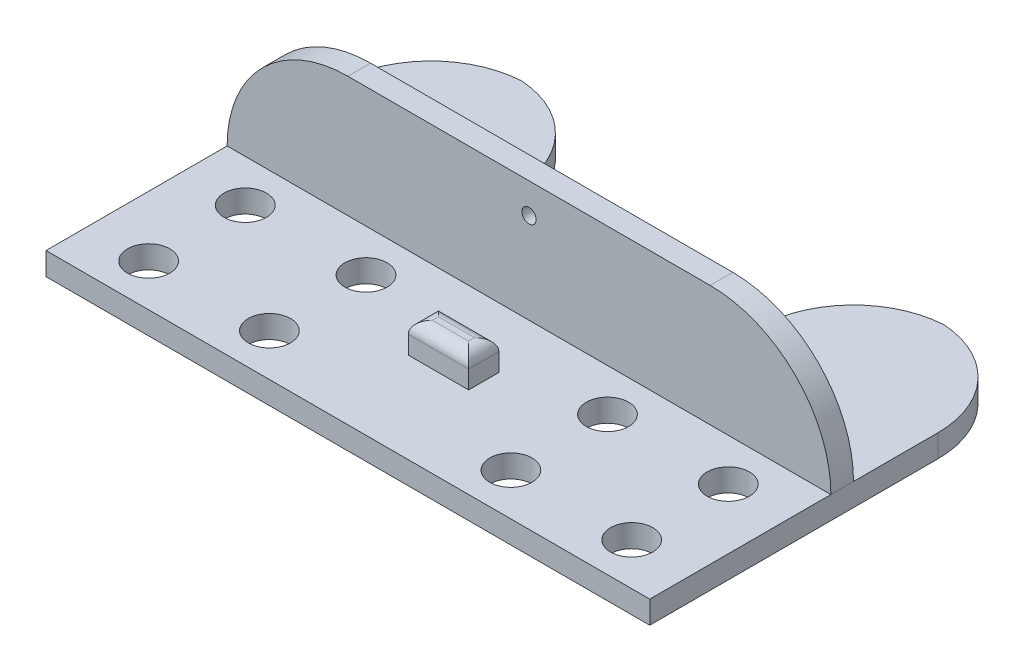
ISO-10303-21;
HEADER;
FILE_DESCRIPTION(('STEP AP214'),'2;1');
FILE_NAME('part.step','',(''),(''),'','','');
FILE_SCHEMA(('AUTOMOTIVE_DESIGN { 1 0 10303 214 1 1 1 1 }'));
ENDSEC;
DATA;
#1=APPLICATION_CONTEXT('core data for automotive mechanical design processes');
#2=APPLICATION_PROTOCOL_DEFINITION('international standard','automotive_design',2000,#1);
#3=PRODUCT_CONTEXT('',#1,'mechanical');
#4=PRODUCT('Part','Part','',(#3));
#5=PRODUCT_RELATED_PRODUCT_CATEGORY('part','',(#4));
#6=PRODUCT_DEFINITION_FORMATION('','',#4);
#7=PRODUCT_DEFINITION_CONTEXT('part definition',#1,'design');
#8=PRODUCT_DEFINITION('design','',#6,#7);
#9=PRODUCT_DEFINITION_SHAPE('','',#8);
#10=(LENGTH_UNIT() NAMED_UNIT(*) SI_UNIT(.MILLI.,.METRE.));
#11=(NAMED_UNIT(*) PLANE_ANGLE_UNIT() SI_UNIT($,.RADIAN.));
#12=(NAMED_UNIT(*) SI_UNIT($,.STERADIAN.) SOLID_ANGLE_UNIT());
#13=UNCERTAINTY_MEASURE_WITH_UNIT(LENGTH_MEASURE(1.E-05),#10,'distance_accuracy_value','');
#14=(GEOMETRIC_REPRESENTATION_CONTEXT(3) GLOBAL_UNCERTAINTY_ASSIGNED_CONTEXT((#13)) GLOBAL_UNIT_ASSIGNED_CONTEXT((#10,
#11,#12)) REPRESENTATION_CONTEXT('',''));
#15=CARTESIAN_POINT('',(0.,0.,0.));
#16=DIRECTION('',(0.,0.,1.));
#17=DIRECTION('',(1.,0.,0.));
#18=AXIS2_PLACEMENT_3D('',#15,#16,#17);
#19=CARTESIAN_POINT('',(127.,4.7625,0.));
#20=DIRECTION('',(0.,1.,0.));
#21=DIRECTION('',(0.,0.,1.));
#22=AXIS2_PLACEMENT_3D('',#19,#20,#21);
#23=PLANE('',#22);
#24=CARTESIAN_POINT('',(17.78,4.7625,-17.78));
#25=DIRECTION('',(0.,1.,0.));
#26=DIRECTION('',(0.,0.,1.));
#27=AXIS2_PLACEMENT_3D('',#24,#25,#26);
#28=CIRCLE('',#27,20.32);
#29=CARTESIAN_POINT('',(38.1,4.7625,-17.78));
#30=VERTEX_POINT('',#29);
#31=CARTESIAN_POINT('',(19.05,4.7625,-38.0602736667926));
#32=VERTEX_POINT('',#31);
#33=EDGE_CURVE('E337',#30,#32,#28,.T.);
#34=ORIENTED_EDGE('',*,*,#33,.T.);
#35=CARTESIAN_POINT('',(20.32,4.7625,-17.78));
#36=DIRECTION('',(0.,1.,0.));
#37=DIRECTION('',(0.,0.,1.));
#38=AXIS2_PLACEMENT_3D('',#35,#36,#37);
#39=CIRCLE('',#38,20.32);
#40=CARTESIAN_POINT('',(0.,4.7625,-17.78));
#41=VERTEX_POINT('',#40);
#42=EDGE_CURVE('E352',#32,#41,#39,.T.);
#43=ORIENTED_EDGE('',*,*,#42,.T.);
#44=DIRECTION('',(0.,0.,-1.));
#45=VECTOR('',#44,1.);
#46=CARTESIAN_POINT('',(0.,4.7625,0.));
#47=LINE('',#46,#45);
#48=CARTESIAN_POINT('',(0.,4.7625,0.));
#49=VERTEX_POINT('',#48);
#50=EDGE_CURVE('E265',#49,#41,#47,.T.);
#51=ORIENTED_EDGE('',*,*,#50,.F.);
#52=DIRECTION('',(-1.,0.,0.));
#53=VECTOR('',#52,1.);
#54=CARTESIAN_POINT('',(127.,4.7625,0.));
#55=LINE('',#54,#53);
#56=CARTESIAN_POINT('',(38.1,4.7625,0.));
#57=VERTEX_POINT('',#56);
#58=EDGE_CURVE('E276',#57,#49,#55,.T.);
#59=ORIENTED_EDGE('',*,*,#58,.F.);
#60=DIRECTION('',(0.,0.,1.));
#61=VECTOR('',#60,1.);
#62=CARTESIAN_POINT('',(38.1,4.7625,-38.1));
#63=LINE('',#62,#61);
#64=EDGE_CURVE('E198',#30,#57,#63,.T.);
#65=ORIENTED_EDGE('',*,*,#64,.F.);
#66=EDGE_LOOP('',(#34,#43,#51,#59,#65));
#67=FACE_BOUND('',#66,.T.);
#68=ADVANCED_FACE('F40',(#67),#23,.T.);
#69=CARTESIAN_POINT('',(127.,4.7625,0.));
#70=DIRECTION('',(0.,1.,0.));
#71=DIRECTION('',(0.,0.,1.));
#72=AXIS2_PLACEMENT_3D('',#69,#70,#71);
#73=PLANE('',#72);
#74=CARTESIAN_POINT('',(38.1,4.7625,13.6525));
#75=DIRECTION('',(0.,1.,0.));
#76=DIRECTION('',(0.,0.,1.));
#77=AXIS2_PLACEMENT_3D('',#74,#75,#76);
#78=CIRCLE('',#77,4.445);
#79=CARTESIAN_POINT('',(38.1,4.7625,18.0975));
#80=VERTEX_POINT('',#79);
#81=EDGE_CURVE('E842',#80,#80,#78,.T.);
#82=ORIENTED_EDGE('',*,*,#81,.F.);
#83=EDGE_LOOP('',(#82));
#84=FACE_BOUND('',#83,.T.);
#85=CARTESIAN_POINT('',(114.3,4.7625,33.9725));
#86=DIRECTION('',(0.,1.,0.));
#87=DIRECTION('',(0.,0.,1.));
#88=AXIS2_PLACEMENT_3D('',#85,#86,#87);
#89=CIRCLE('',#88,4.445);
#90=CARTESIAN_POINT('',(114.3,4.7625,38.4175));
#91=VERTEX_POINT('',#90);
#92=EDGE_CURVE('E832',#91,#91,#89,.T.);
#93=ORIENTED_EDGE('',*,*,#92,.F.);
#94=EDGE_LOOP('',(#93));
#95=FACE_BOUND('',#94,.T.);
#96=CARTESIAN_POINT('',(114.3,4.7625,13.6525));
#97=DIRECTION('',(0.,1.,0.));
#98=DIRECTION('',(0.,0.,1.));
#99=AXIS2_PLACEMENT_3D('',#96,#97,#98);
#100=CIRCLE('',#99,4.445);
#101=CARTESIAN_POINT('',(114.3,4.7625,18.0975));
#102=VERTEX_POINT('',#101);
#103=EDGE_CURVE('E839',#102,#102,#100,.T.);
#104=ORIENTED_EDGE('',*,*,#103,.F.);
#105=EDGE_LOOP('',(#104));
#106=FACE_BOUND('',#105,.T.);
#107=CARTESIAN_POINT('',(12.7,4.7625,33.9725));
#108=DIRECTION('',(0.,1.,0.));
#109=DIRECTION('',(0.,0.,1.));
#110=AXIS2_PLACEMENT_3D('',#107,#108,#109);
#111=CIRCLE('',#110,4.445);
#112=CARTESIAN_POINT('',(12.7,4.7625,38.4175));
#113=VERTEX_POINT('',#112);
#114=EDGE_CURVE('E855',#113,#113,#111,.T.);
#115=ORIENTED_EDGE('',*,*,#114,.F.);
#116=EDGE_LOOP('',(#115));
#117=FACE_BOUND('',#116,.T.);
#118=CARTESIAN_POINT('',(88.9,4.7625,33.9725));
#119=DIRECTION('',(0.,1.,0.));
#120=DIRECTION('',(0.,0.,1.));
#121=AXIS2_PLACEMENT_3D('',#118,#119,#120);
#122=CIRCLE('',#121,4.445);
#123=CARTESIAN_POINT('',(88.9,4.7625,38.4175));
#124=VERTEX_POINT('',#123);
#125=EDGE_CURVE('E886',#124,#124,#122,.T.);
#126=ORIENTED_EDGE('',*,*,#125,.F.);
#127=EDGE_LOOP('',(#126));
#128=FACE_BOUND('',#127,.T.);
#129=CARTESIAN_POINT('',(38.1,4.7625,33.9725));
#130=DIRECTION('',(0.,1.,0.));
#131=DIRECTION('',(0.,0.,1.));
#132=AXIS2_PLACEMENT_3D('',#129,#130,#131);
#133=CIRCLE('',#132,4.445);
#134=CARTESIAN_POINT('',(38.1,4.7625,38.4175));
#135=VERTEX_POINT('',#134);
#136=EDGE_CURVE('E890',#135,#135,#133,.T.);
#137=ORIENTED_EDGE('',*,*,#136,.F.);
#138=EDGE_LOOP('',(#137));
#139=FACE_BOUND('',#138,.T.);
#140=CARTESIAN_POINT('',(88.9,4.7625,13.6525));
#141=DIRECTION('',(0.,1.,0.));
#142=DIRECTION('',(0.,0.,1.));
#143=AXIS2_PLACEMENT_3D('',#140,#141,#142);
#144=CIRCLE('',#143,4.445);
#145=CARTESIAN_POINT('',(88.9,4.7625,18.0975));
#146=VERTEX_POINT('',#145);
#147=EDGE_CURVE('E893',#146,#146,#144,.T.);
#148=ORIENTED_EDGE('',*,*,#147,.F.);
#149=EDGE_LOOP('',(#148));
#150=FACE_BOUND('',#149,.T.);
#151=CARTESIAN_POINT('',(12.7,4.7625,13.6525));
#152=DIRECTION('',(0.,1.,0.));
#153=DIRECTION('',(0.,0.,1.));
#154=AXIS2_PLACEMENT_3D('',#151,#152,#153);
#155=CIRCLE('',#154,4.44499999999999);
#156=CARTESIAN_POINT('',(12.7,4.7625,18.0975));
#157=VERTEX_POINT('',#156);
#158=EDGE_CURVE('E854',#157,#157,#155,.T.);
#159=ORIENTED_EDGE('',*,*,#158,.F.);
#160=EDGE_LOOP('',(#159));
#161=FACE_BOUND('',#160,.T.);
#162=DIRECTION('',(0.,0.,-1.));
#163=VECTOR('',#162,1.);
#164=CARTESIAN_POINT('',(0.,4.7625,0.));
#165=LINE('',#164,#163);
#166=CARTESIAN_POINT('',(0.,4.7625,42.8625));
#167=VERTEX_POINT('',#166);
#168=CARTESIAN_POINT('',(0.,4.7625,4.7625));
#169=VERTEX_POINT('',#168);
#170=EDGE_CURVE('E259',#167,#169,#165,.T.);
#171=ORIENTED_EDGE('',*,*,#170,.F.);
#172=DIRECTION('',(-1.,0.,0.));
#173=VECTOR('',#172,1.);
#174=CARTESIAN_POINT('',(127.,4.7625,42.8625));
#175=LINE('',#174,#173);
#176=CARTESIAN_POINT('',(127.,4.7625,42.8625));
#177=VERTEX_POINT('',#176);
#178=EDGE_CURVE('E297',#177,#167,#175,.T.);
#179=ORIENTED_EDGE('',*,*,#178,.F.);
#180=DIRECTION('',(0.,0.,-1.));
#181=VECTOR('',#180,1.);
#182=CARTESIAN_POINT('',(127.,4.7625,0.));
#183=LINE('',#182,#181);
#184=CARTESIAN_POINT('',(127.,4.7625,4.7625));
#185=VERTEX_POINT('',#184);
#186=EDGE_CURVE('E260',#177,#185,#183,.T.);
#187=ORIENTED_EDGE('',*,*,#186,.T.);
#188=DIRECTION('',(-1.,0.,0.));
#189=VECTOR('',#188,1.);
#190=CARTESIAN_POINT('',(127.,4.7625,4.7625));
#191=LINE('',#190,#189);
#192=EDGE_CURVE('E300',#185,#169,#191,.T.);
#193=ORIENTED_EDGE('',*,*,#192,.T.);
#194=EDGE_LOOP('',(#171,#179,#187,#193));
#195=FACE_BOUND('',#194,.T.);
#196=DIRECTION('',(1.,0.,0.));
#197=VECTOR('',#196,1.);
#198=CARTESIAN_POINT('',(57.15,4.7625,23.8125));
#199=LINE('',#198,#197);
#200=CARTESIAN_POINT('',(57.15,4.7625,23.8125));
#201=VERTEX_POINT('',#200);
#202=CARTESIAN_POINT('',(69.85,4.7625,23.8125));
#203=VERTEX_POINT('',#202);
#204=EDGE_CURVE('E235',#201,#203,#199,.T.);
#205=ORIENTED_EDGE('',*,*,#204,.F.);
#206=DIRECTION('',(0.,0.,1.));
#207=VECTOR('',#206,1.);
#208=CARTESIAN_POINT('',(57.15,4.7625,23.8125));
#209=LINE('',#208,#207);
#210=CARTESIAN_POINT('',(57.15,4.7625,17.4625));
#211=VERTEX_POINT('',#210);
#212=EDGE_CURVE('E231',#211,#201,#209,.T.);
#213=ORIENTED_EDGE('',*,*,#212,.F.);
#214=DIRECTION('',(-1.,0.,0.));
#215=VECTOR('',#214,1.);
#216=CARTESIAN_POINT('',(57.15,4.7625,17.4625));
#217=LINE('',#216,#215);
#218=CARTESIAN_POINT('',(69.85,4.7625,17.4625));
#219=VERTEX_POINT('',#218);
#220=EDGE_CURVE('E243',#219,#211,#217,.T.);
#221=ORIENTED_EDGE('',*,*,#220,.F.);
#222=DIRECTION('',(0.,0.,-1.));
#223=VECTOR('',#222,1.);
#224=CARTESIAN_POINT('',(69.85,4.7625,23.8125));
#225=LINE('',#224,#223);
#226=EDGE_CURVE('E239',#203,#219,#225,.T.);
#227=ORIENTED_EDGE('',*,*,#226,.F.);
#228=EDGE_LOOP('',(#205,#213,#221,#227));
#229=FACE_BOUND('',#228,.T.);
#230=ADVANCED_FACE('F432',(#84,#95,#106,#117,#128,#139,#150,#161,#195,#229),#73,.T.);
#231=CARTESIAN_POINT('',(127.,0.,0.));
#232=DIRECTION('',(0.,0.,-1.));
#233=DIRECTION('',(0.,1.,0.));
#234=AXIS2_PLACEMENT_3D('',#231,#232,#233);
#235=PLANE('',#234);
#236=CARTESIAN_POINT('',(63.5,23.8125,0.));
#237=DIRECTION('',(0.,0.,-1.));
#238=DIRECTION('',(0.,1.,0.));
#239=AXIS2_PLACEMENT_3D('',#236,#237,#238);
#240=CIRCLE('',#239,1.49999700000001);
#241=CARTESIAN_POINT('',(63.5,25.312497,0.));
#242=VERTEX_POINT('',#241);
#243=EDGE_CURVE('E226',#242,#242,#240,.T.);
#244=ORIENTED_EDGE('',*,*,#243,.F.);
#245=EDGE_LOOP('',(#244));
#246=FACE_BOUND('',#245,.T.);
#247=DIRECTION('',(-1.,0.,0.));
#248=VECTOR('',#247,1.);
#249=CARTESIAN_POINT('',(127.,30.1625,0.));
#250=LINE('',#249,#248);
#251=CARTESIAN_POINT('',(101.6,30.1625,0.));
#252=VERTEX_POINT('',#251);
#253=CARTESIAN_POINT('',(25.4,30.1625,0.));
#254=VERTEX_POINT('',#253);
#255=EDGE_CURVE('E308',#252,#254,#250,.T.);
#256=ORIENTED_EDGE('',*,*,#255,.F.);
#257=CARTESIAN_POINT('',(101.6,4.7625,0.));
#258=DIRECTION('',(0.,0.,-1.));
#259=DIRECTION('',(0.,1.,0.));
#260=AXIS2_PLACEMENT_3D('',#257,#258,#259);
#261=CIRCLE('',#260,25.4);
#262=CARTESIAN_POINT('',(127.,4.7625,0.));
#263=VERTEX_POINT('',#262);
#264=EDGE_CURVE('E64',#252,#263,#261,.T.);
#265=ORIENTED_EDGE('',*,*,#264,.T.);
#266=CARTESIAN_POINT('',(88.9,4.7625,0.));
#267=VERTEX_POINT('',#266);
#268=EDGE_CURVE('E290',#263,#267,#55,.T.);
#269=ORIENTED_EDGE('',*,*,#268,.T.);
#270=DIRECTION('',(0.,1.,0.));
#271=VECTOR('',#270,1.);
#272=CARTESIAN_POINT('',(88.9,0.,0.));
#273=LINE('',#272,#271);
#274=CARTESIAN_POINT('',(88.9,0.,0.));
#275=VERTEX_POINT('',#274);
#276=EDGE_CURVE('E201',#275,#267,#273,.T.);
#277=ORIENTED_EDGE('',*,*,#276,.F.);
#278=DIRECTION('',(1.,0.,0.));
#279=VECTOR('',#278,1.);
#280=CARTESIAN_POINT('',(38.1,0.,0.));
#281=LINE('',#280,#279);
#282=CARTESIAN_POINT('',(38.1,0.,0.));
#283=VERTEX_POINT('',#282);
#284=EDGE_CURVE('E186',#283,#275,#281,.T.);
#285=ORIENTED_EDGE('',*,*,#284,.F.);
#286=DIRECTION('',(0.,1.,0.));
#287=VECTOR('',#286,1.);
#288=CARTESIAN_POINT('',(38.1,0.,0.));
#289=LINE('',#288,#287);
#290=EDGE_CURVE('E195',#283,#57,#289,.T.);
#291=ORIENTED_EDGE('',*,*,#290,.T.);
#292=ORIENTED_EDGE('',*,*,#58,.T.);
#293=CARTESIAN_POINT('',(25.4,4.7625,0.));
#294=DIRECTION('',(0.,0.,-1.));
#295=DIRECTION('',(0.,1.,0.));
#296=AXIS2_PLACEMENT_3D('',#293,#294,#295);
#297=CIRCLE('',#296,25.4);
#298=EDGE_CURVE('E56',#49,#254,#297,.T.);
#299=ORIENTED_EDGE('',*,*,#298,.T.);
#300=EDGE_LOOP('',(#256,#265,#269,#277,#285,#291,#292,#299));
#301=FACE_BOUND('',#300,.T.);
#302=ADVANCED_FACE('F204',(#246,#301),#235,.T.);
#303=CARTESIAN_POINT('',(127.,30.1625,0.));
#304=DIRECTION('',(0.,1.,0.));
#305=DIRECTION('',(0.,0.,1.));
#306=AXIS2_PLACEMENT_3D('',#303,#304,#305);
#307=PLANE('',#306);
#308=DIRECTION('',(-1.,0.,0.));
#309=VECTOR('',#308,1.);
#310=CARTESIAN_POINT('',(127.,30.1625,4.7625));
#311=LINE('',#310,#309);
#312=CARTESIAN_POINT('',(101.6,30.1625,4.7625));
#313=VERTEX_POINT('',#312);
#314=CARTESIAN_POINT('',(25.4,30.1625,4.7625));
#315=VERTEX_POINT('',#314);
#316=EDGE_CURVE('E304',#313,#315,#311,.T.);
#317=ORIENTED_EDGE('',*,*,#316,.F.);
#318=DIRECTION('',(0.,0.,-1.));
#319=VECTOR('',#318,1.);
#320=CARTESIAN_POINT('',(101.6,30.1625,0.));
#321=LINE('',#320,#319);
#322=EDGE_CURVE('E397',#313,#252,#321,.T.);
#323=ORIENTED_EDGE('',*,*,#322,.T.);
#324=ORIENTED_EDGE('',*,*,#255,.T.);
#325=DIRECTION('',(0.,0.,-1.));
#326=VECTOR('',#325,1.);
#327=CARTESIAN_POINT('',(25.4,30.1625,4.7625));
#328=LINE('',#327,#326);
#329=EDGE_CURVE('E386',#254,#315,#328,.F.);
#330=ORIENTED_EDGE('',*,*,#329,.T.);
#331=EDGE_LOOP('',(#317,#323,#324,#330));
#332=FACE_BOUND('',#331,.T.);
#333=ADVANCED_FACE('F417',(#332),#307,.T.);
#334=CARTESIAN_POINT('',(127.,0.,4.7625));
#335=DIRECTION('',(0.,0.,1.));
#336=DIRECTION('',(0.,-1.,0.));
#337=AXIS2_PLACEMENT_3D('',#334,#335,#336);
#338=PLANE('',#337);
#339=CARTESIAN_POINT('',(63.5,23.8125,4.7625));
#340=DIRECTION('',(0.,0.,1.));
#341=DIRECTION('',(1.,0.,0.));
#342=AXIS2_PLACEMENT_3D('',#339,#340,#341);
#343=CIRCLE('',#342,1.49999700000001);
#344=CARTESIAN_POINT('',(64.999997,23.8125,4.7625));
#345=VERTEX_POINT('',#344);
#346=EDGE_CURVE('E222',#345,#345,#343,.T.);
#347=ORIENTED_EDGE('',*,*,#346,.F.);
#348=EDGE_LOOP('',(#347));
#349=FACE_BOUND('',#348,.T.);
#350=ORIENTED_EDGE('',*,*,#192,.F.);
#351=CARTESIAN_POINT('',(101.6,4.7625,4.7625));
#352=DIRECTION('',(0.,0.,1.));
#353=DIRECTION('',(0.,-1.,0.));
#354=AXIS2_PLACEMENT_3D('',#351,#352,#353);
#355=CIRCLE('',#354,25.4);
#356=EDGE_CURVE('E49',#185,#313,#355,.T.);
#357=ORIENTED_EDGE('',*,*,#356,.T.);
#358=ORIENTED_EDGE('',*,*,#316,.T.);
#359=CARTESIAN_POINT('',(25.4,4.7625,4.7625));
#360=DIRECTION('',(0.,0.,1.));
#361=DIRECTION('',(0.,-1.,0.));
#362=AXIS2_PLACEMENT_3D('',#359,#360,#361);
#363=CIRCLE('',#362,25.4);
#364=EDGE_CURVE('E407',#315,#169,#363,.T.);
#365=ORIENTED_EDGE('',*,*,#364,.T.);
#366=EDGE_LOOP('',(#350,#357,#358,#365));
#367=FACE_BOUND('',#366,.T.);
#368=ADVANCED_FACE('F414',(#349,#367),#338,.T.);
#369=CARTESIAN_POINT('',(127.,0.,42.8625));
#370=DIRECTION('',(0.,0.,1.));
#371=DIRECTION('',(1.,0.,0.));
#372=AXIS2_PLACEMENT_3D('',#369,#370,#371);
#373=PLANE('',#372);
#374=DIRECTION('',(0.,1.,0.));
#375=VECTOR('',#374,1.);
#376=CARTESIAN_POINT('',(0.,0.,42.8625));
#377=LINE('',#376,#375);
#378=CARTESIAN_POINT('',(0.,0.,42.8625));
#379=VERTEX_POINT('',#378);
#380=EDGE_CURVE('E280',#379,#167,#377,.T.);
#381=ORIENTED_EDGE('',*,*,#380,.F.);
#382=DIRECTION('',(-1.,0.,0.));
#383=VECTOR('',#382,1.);
#384=CARTESIAN_POINT('',(127.,0.,42.8625));
#385=LINE('',#384,#383);
#386=CARTESIAN_POINT('',(127.,0.,42.8625));
#387=VERTEX_POINT('',#386);
#388=EDGE_CURVE('E293',#387,#379,#385,.T.);
#389=ORIENTED_EDGE('',*,*,#388,.F.);
#390=DIRECTION('',(0.,1.,0.));
#391=VECTOR('',#390,1.);
#392=CARTESIAN_POINT('',(127.,0.,42.8625));
#393=LINE('',#392,#391);
#394=EDGE_CURVE('E264',#387,#177,#393,.T.);
#395=ORIENTED_EDGE('',*,*,#394,.T.);
#396=ORIENTED_EDGE('',*,*,#178,.T.);
#397=EDGE_LOOP('',(#381,#389,#395,#396));
#398=FACE_BOUND('',#397,.T.);
#399=ADVANCED_FACE('F455',(#398),#373,.T.);
#400=CARTESIAN_POINT('',(127.,0.,0.));
#401=DIRECTION('',(0.,-1.,0.));
#402=DIRECTION('',(0.,0.,-1.));
#403=AXIS2_PLACEMENT_3D('',#400,#401,#402);
#404=PLANE('',#403);
#405=CARTESIAN_POINT('',(38.1,0.,13.6525));
#406=DIRECTION('',(0.,1.,0.));
#407=DIRECTION('',(0.,0.,1.));
#408=AXIS2_PLACEMENT_3D('',#405,#406,#407);
#409=CIRCLE('',#408,4.445);
#410=CARTESIAN_POINT('',(38.1,0.,18.0975));
#411=VERTEX_POINT('',#410);
#412=EDGE_CURVE('E835',#411,#411,#409,.T.);
#413=ORIENTED_EDGE('',*,*,#412,.T.);
#414=EDGE_LOOP('',(#413));
#415=FACE_BOUND('',#414,.T.);
#416=CARTESIAN_POINT('',(114.3,0.,33.9725));
#417=DIRECTION('',(0.,1.,0.));
#418=DIRECTION('',(0.,0.,1.));
#419=AXIS2_PLACEMENT_3D('',#416,#417,#418);
#420=CIRCLE('',#419,4.445);
#421=CARTESIAN_POINT('',(114.3,0.,38.4175));
#422=VERTEX_POINT('',#421);
#423=EDGE_CURVE('E829',#422,#422,#420,.T.);
#424=ORIENTED_EDGE('',*,*,#423,.T.);
#425=EDGE_LOOP('',(#424));
#426=FACE_BOUND('',#425,.T.);
#427=CARTESIAN_POINT('',(114.3,0.,13.6525));
#428=DIRECTION('',(0.,1.,0.));
#429=DIRECTION('',(0.,0.,1.));
#430=AXIS2_PLACEMENT_3D('',#427,#428,#429);
#431=CIRCLE('',#430,4.445);
#432=CARTESIAN_POINT('',(114.3,0.,18.0975));
#433=VERTEX_POINT('',#432);
#434=EDGE_CURVE('E859',#433,#433,#431,.T.);
#435=ORIENTED_EDGE('',*,*,#434,.T.);
#436=EDGE_LOOP('',(#435));
#437=FACE_BOUND('',#436,.T.);
#438=CARTESIAN_POINT('',(12.7,0.,33.9725));
#439=DIRECTION('',(0.,1.,0.));
#440=DIRECTION('',(0.,0.,1.));
#441=AXIS2_PLACEMENT_3D('',#438,#439,#440);
#442=CIRCLE('',#441,4.445);
#443=CARTESIAN_POINT('',(12.7,0.,38.4175));
#444=VERTEX_POINT('',#443);
#445=EDGE_CURVE('E850',#444,#444,#442,.T.);
#446=ORIENTED_EDGE('',*,*,#445,.T.);
#447=EDGE_LOOP('',(#446));
#448=FACE_BOUND('',#447,.T.);
#449=CARTESIAN_POINT('',(88.9,0.,33.9725));
#450=DIRECTION('',(0.,1.,0.));
#451=DIRECTION('',(0.,0.,1.));
#452=AXIS2_PLACEMENT_3D('',#449,#450,#451);
#453=CIRCLE('',#452,4.445);
#454=CARTESIAN_POINT('',(88.9,0.,38.4175));
#455=VERTEX_POINT('',#454);
#456=EDGE_CURVE('E906',#455,#455,#453,.T.);
#457=ORIENTED_EDGE('',*,*,#456,.T.);
#458=EDGE_LOOP('',(#457));
#459=FACE_BOUND('',#458,.T.);
#460=CARTESIAN_POINT('',(38.1,0.,33.9725));
#461=DIRECTION('',(0.,1.,0.));
#462=DIRECTION('',(0.,0.,1.));
#463=AXIS2_PLACEMENT_3D('',#460,#461,#462);
#464=CIRCLE('',#463,4.445);
#465=CARTESIAN_POINT('',(38.1,0.,38.4175));
#466=VERTEX_POINT('',#465);
#467=EDGE_CURVE('E896',#466,#466,#464,.T.);
#468=ORIENTED_EDGE('',*,*,#467,.T.);
#469=EDGE_LOOP('',(#468));
#470=FACE_BOUND('',#469,.T.);
#471=CARTESIAN_POINT('',(88.9,0.,13.6525));
#472=DIRECTION('',(0.,1.,0.));
#473=DIRECTION('',(0.,0.,1.));
#474=AXIS2_PLACEMENT_3D('',#471,#472,#473);
#475=CIRCLE('',#474,4.445);
#476=CARTESIAN_POINT('',(88.9,0.,18.0975));
#477=VERTEX_POINT('',#476);
#478=EDGE_CURVE('E849',#477,#477,#475,.T.);
#479=ORIENTED_EDGE('',*,*,#478,.T.);
#480=EDGE_LOOP('',(#479));
#481=FACE_BOUND('',#480,.T.);
#482=CARTESIAN_POINT('',(12.7,0.,13.6525));
#483=DIRECTION('',(0.,1.,0.));
#484=DIRECTION('',(0.,0.,1.));
#485=AXIS2_PLACEMENT_3D('',#482,#483,#484);
#486=CIRCLE('',#485,4.44499999999999);
#487=CARTESIAN_POINT('',(12.7,0.,18.0975));
#488=VERTEX_POINT('',#487);
#489=EDGE_CURVE('E394',#488,#488,#486,.T.);
#490=ORIENTED_EDGE('',*,*,#489,.T.);
#491=EDGE_LOOP('',(#490));
#492=FACE_BOUND('',#491,.T.);
#493=DIRECTION('',(0.,0.,1.));
#494=VECTOR('',#493,1.);
#495=CARTESIAN_POINT('',(0.,0.,0.));
#496=LINE('',#495,#494);
#497=CARTESIAN_POINT('',(0.,0.,-17.78));
#498=VERTEX_POINT('',#497);
#499=EDGE_CURVE('E284',#498,#379,#496,.T.);
#500=ORIENTED_EDGE('',*,*,#499,.F.);
#501=CARTESIAN_POINT('',(20.32,0.,-17.78));
#502=DIRECTION('',(0.,-1.,0.));
#503=DIRECTION('',(0.,0.,-1.));
#504=AXIS2_PLACEMENT_3D('',#501,#502,#503);
#505=CIRCLE('',#504,20.32);
#506=CARTESIAN_POINT('',(19.05,0.,-38.0602736667926));
#507=VERTEX_POINT('',#506);
#508=EDGE_CURVE('E367',#498,#507,#505,.T.);
#509=ORIENTED_EDGE('',*,*,#508,.T.);
#510=CARTESIAN_POINT('',(17.78,0.,-17.78));
#511=DIRECTION('',(0.,-1.,0.));
#512=DIRECTION('',(0.,0.,-1.));
#513=AXIS2_PLACEMENT_3D('',#510,#511,#512);
#514=CIRCLE('',#513,20.32);
#515=CARTESIAN_POINT('',(38.1,0.,-17.78));
#516=VERTEX_POINT('',#515);
#517=EDGE_CURVE('E188',#507,#516,#514,.T.);
#518=ORIENTED_EDGE('',*,*,#517,.T.);
#519=DIRECTION('',(0.,0.,1.));
#520=VECTOR('',#519,1.);
#521=CARTESIAN_POINT('',(38.1,0.,-38.1));
#522=LINE('',#521,#520);
#523=EDGE_CURVE('E180',#516,#283,#522,.T.);
#524=ORIENTED_EDGE('',*,*,#523,.T.);
#525=ORIENTED_EDGE('',*,*,#284,.T.);
#526=DIRECTION('',(0.,0.,-1.));
#527=VECTOR('',#526,1.);
#528=CARTESIAN_POINT('',(88.9,0.,-38.1));
#529=LINE('',#528,#527);
#530=CARTESIAN_POINT('',(88.9,0.,-17.78));
#531=VERTEX_POINT('',#530);
#532=EDGE_CURVE('E202',#275,#531,#529,.T.);
#533=ORIENTED_EDGE('',*,*,#532,.T.);
#534=CARTESIAN_POINT('',(109.22,0.,-17.78));
#535=DIRECTION('',(0.,-1.,0.));
#536=DIRECTION('',(0.,0.,-1.));
#537=AXIS2_PLACEMENT_3D('',#534,#535,#536);
#538=CIRCLE('',#537,20.32);
#539=CARTESIAN_POINT('',(107.95,0.,-38.0602736667926));
#540=VERTEX_POINT('',#539);
#541=EDGE_CURVE('E362',#531,#540,#538,.T.);
#542=ORIENTED_EDGE('',*,*,#541,.T.);
#543=CARTESIAN_POINT('',(106.68,0.,-17.78));
#544=DIRECTION('',(0.,-1.,0.));
#545=DIRECTION('',(0.,0.,-1.));
#546=AXIS2_PLACEMENT_3D('',#543,#544,#545);
#547=CIRCLE('',#546,20.32);
#548=CARTESIAN_POINT('',(127.,0.,-17.78));
#549=VERTEX_POINT('',#548);
#550=EDGE_CURVE('E359',#540,#549,#547,.T.);
#551=ORIENTED_EDGE('',*,*,#550,.T.);
#552=DIRECTION('',(0.,0.,1.));
#553=VECTOR('',#552,1.);
#554=CARTESIAN_POINT('',(127.,0.,0.));
#555=LINE('',#554,#553);
#556=EDGE_CURVE('E269',#549,#387,#555,.T.);
#557=ORIENTED_EDGE('',*,*,#556,.T.);
#558=ORIENTED_EDGE('',*,*,#388,.T.);
#559=EDGE_LOOP('',(#500,#509,#518,#524,#525,#533,#542,#551,#557,#558));
#560=FACE_BOUND('',#559,.T.);
#561=ADVANCED_FACE('F183',(#415,#426,#437,#448,#459,#470,#481,#492,#560),#404,.T.);
#562=CARTESIAN_POINT('',(106.68,4.7625,-17.78));
#563=DIRECTION('',(0.,1.,0.));
#564=DIRECTION('',(0.,0.,1.));
#565=AXIS2_PLACEMENT_3D('',#562,#563,#564);
#566=CIRCLE('',#565,20.32);
#567=CARTESIAN_POINT('',(127.,4.7625,-17.78));
#568=VERTEX_POINT('',#567);
#569=CARTESIAN_POINT('',(107.95,4.7625,-38.0602736667926));
#570=VERTEX_POINT('',#569);
#571=EDGE_CURVE('E373',#568,#570,#566,.T.);
#572=ORIENTED_EDGE('',*,*,#571,.T.);
#573=CARTESIAN_POINT('',(109.22,4.7625,-17.78));
#574=DIRECTION('',(0.,1.,0.));
#575=DIRECTION('',(0.,0.,1.));
#576=AXIS2_PLACEMENT_3D('',#573,#574,#575);
#577=CIRCLE('',#576,20.32);
#578=CARTESIAN_POINT('',(88.9,4.7625,-17.78));
#579=VERTEX_POINT('',#578);
#580=EDGE_CURVE('E376',#570,#579,#577,.T.);
#581=ORIENTED_EDGE('',*,*,#580,.T.);
#582=DIRECTION('',(0.,0.,-1.));
#583=VECTOR('',#582,1.);
#584=CARTESIAN_POINT('',(88.9,4.7625,-38.1));
#585=LINE('',#584,#583);
#586=EDGE_CURVE('E192',#267,#579,#585,.T.);
#587=ORIENTED_EDGE('',*,*,#586,.F.);
#588=ORIENTED_EDGE('',*,*,#268,.F.);
#589=DIRECTION('',(0.,0.,-1.));
#590=VECTOR('',#589,1.);
#591=CARTESIAN_POINT('',(127.,4.7625,0.));
#592=LINE('',#591,#590);
#593=EDGE_CURVE('E272',#263,#568,#592,.T.);
#594=ORIENTED_EDGE('',*,*,#593,.T.);
#595=EDGE_LOOP('',(#572,#581,#587,#588,#594));
#596=FACE_BOUND('',#595,.T.);
#597=ADVANCED_FACE('F435',(#596),#23,.T.);
#598=CARTESIAN_POINT('',(127.,0.,0.));
#599=DIRECTION('',(1.,0.,0.));
#600=DIRECTION('',(0.,0.,-1.));
#601=AXIS2_PLACEMENT_3D('',#598,#599,#600);
#602=PLANE('',#601);
#603=ORIENTED_EDGE('',*,*,#593,.F.);
#604=DIRECTION('',(0.,0.,-1.));
#605=VECTOR('',#604,1.);
#606=CARTESIAN_POINT('',(127.,4.7625,0.));
#607=LINE('',#606,#605);
#608=EDGE_CURVE('E404',#263,#185,#607,.F.);
#609=ORIENTED_EDGE('',*,*,#608,.T.);
#610=ORIENTED_EDGE('',*,*,#186,.F.);
#611=ORIENTED_EDGE('',*,*,#394,.F.);
#612=ORIENTED_EDGE('',*,*,#556,.F.);
#613=DIRECTION('',(0.,1.,0.));
#614=VECTOR('',#613,1.);
#615=CARTESIAN_POINT('',(127.,4.7625,-17.78));
#616=LINE('',#615,#614);
#617=EDGE_CURVE('E383',#549,#568,#616,.T.);
#618=ORIENTED_EDGE('',*,*,#617,.T.);
#619=EDGE_LOOP('',(#603,#609,#610,#611,#612,#618));
#620=FACE_BOUND('',#619,.T.);
#621=ADVANCED_FACE('F445',(#620),#602,.T.);
#622=CARTESIAN_POINT('',(0.,0.,0.));
#623=DIRECTION('',(1.,0.,0.));
#624=DIRECTION('',(0.,0.,-1.));
#625=AXIS2_PLACEMENT_3D('',#622,#623,#624);
#626=PLANE('',#625);
#627=ORIENTED_EDGE('',*,*,#170,.T.);
#628=DIRECTION('',(0.,0.,-1.));
#629=VECTOR('',#628,1.);
#630=CARTESIAN_POINT('',(0.,4.7625,0.));
#631=LINE('',#630,#629);
#632=EDGE_CURVE('E11',#169,#49,#631,.T.);
#633=ORIENTED_EDGE('',*,*,#632,.T.);
#634=ORIENTED_EDGE('',*,*,#50,.T.);
#635=DIRECTION('',(0.,1.,0.));
#636=VECTOR('',#635,1.);
#637=CARTESIAN_POINT('',(0.,0.,-17.78));
#638=LINE('',#637,#636);
#639=EDGE_CURVE('E355',#41,#498,#638,.F.);
#640=ORIENTED_EDGE('',*,*,#639,.T.);
#641=ORIENTED_EDGE('',*,*,#499,.T.);
#642=ORIENTED_EDGE('',*,*,#380,.T.);
#643=EDGE_LOOP('',(#627,#633,#634,#640,#641,#642));
#644=FACE_BOUND('',#643,.T.);
#645=ADVANCED_FACE('F451',(#644),#626,.F.);
#646=CARTESIAN_POINT('',(57.15,11.1125,23.8125));
#647=DIRECTION('',(1.,0.,0.));
#648=DIRECTION('',(0.,0.,-1.));
#649=AXIS2_PLACEMENT_3D('',#646,#647,#648);
#650=PLANE('',#649);
#651=DIRECTION('',(0.,-1.,0.));
#652=VECTOR('',#651,1.);
#653=CARTESIAN_POINT('',(57.15,11.1125,23.8125));
#654=LINE('',#653,#652);
#655=CARTESIAN_POINT('',(57.15,8.5725,23.8125));
#656=VERTEX_POINT('',#655);
#657=EDGE_CURVE('E256',#656,#201,#654,.T.);
#658=ORIENTED_EDGE('',*,*,#657,.F.);
#659=DIRECTION('',(0.,0.,1.));
#660=VECTOR('',#659,1.);
#661=CARTESIAN_POINT('',(57.15,8.5725,23.8125));
#662=LINE('',#661,#660);
#663=CARTESIAN_POINT('',(57.15,8.5725,17.4625));
#664=VERTEX_POINT('',#663);
#665=EDGE_CURVE('E334',#656,#664,#662,.F.);
#666=ORIENTED_EDGE('',*,*,#665,.T.);
#667=DIRECTION('',(0.,-1.,0.));
#668=VECTOR('',#667,1.);
#669=CARTESIAN_POINT('',(57.15,11.1125,17.4625));
#670=LINE('',#669,#668);
#671=EDGE_CURVE('E247',#664,#211,#670,.T.);
#672=ORIENTED_EDGE('',*,*,#671,.T.);
#673=ORIENTED_EDGE('',*,*,#212,.T.);
#674=EDGE_LOOP('',(#658,#666,#672,#673));
#675=FACE_BOUND('',#674,.T.);
#676=ADVANCED_FACE('F587',(#675),#650,.F.);
#677=CARTESIAN_POINT('',(57.15,11.1125,23.8125));
#678=DIRECTION('',(0.,0.,-1.));
#679=DIRECTION('',(0.,1.,0.));
#680=AXIS2_PLACEMENT_3D('',#677,#678,#679);
#681=PLANE('',#680);
#682=DIRECTION('',(0.,-1.,0.));
#683=VECTOR('',#682,1.);
#684=CARTESIAN_POINT('',(69.85,11.1125,23.8125));
#685=LINE('',#684,#683);
#686=CARTESIAN_POINT('',(69.85,8.5725,23.8125));
#687=VERTEX_POINT('',#686);
#688=EDGE_CURVE('E253',#687,#203,#685,.T.);
#689=ORIENTED_EDGE('',*,*,#688,.F.);
#690=DIRECTION('',(1.,0.,0.));
#691=VECTOR('',#690,1.);
#692=CARTESIAN_POINT('',(57.15,8.5725,23.8125));
#693=LINE('',#692,#691);
#694=EDGE_CURVE('E331',#687,#656,#693,.F.);
#695=ORIENTED_EDGE('',*,*,#694,.T.);
#696=ORIENTED_EDGE('',*,*,#657,.T.);
#697=ORIENTED_EDGE('',*,*,#204,.T.);
#698=EDGE_LOOP('',(#689,#695,#696,#697));
#699=FACE_BOUND('',#698,.T.);
#700=ADVANCED_FACE('F758',(#699),#681,.F.);
#701=CARTESIAN_POINT('',(69.85,11.1125,23.8125));
#702=DIRECTION('',(-1.,0.,0.));
#703=DIRECTION('',(0.,0.,1.));
#704=AXIS2_PLACEMENT_3D('',#701,#702,#703);
#705=PLANE('',#704);
#706=DIRECTION('',(0.,-1.,0.));
#707=VECTOR('',#706,1.);
#708=CARTESIAN_POINT('',(69.85,11.1125,17.4625));
#709=LINE('',#708,#707);
#710=CARTESIAN_POINT('',(69.85,8.5725,17.4625));
#711=VERTEX_POINT('',#710);
#712=EDGE_CURVE('E250',#711,#219,#709,.T.);
#713=ORIENTED_EDGE('',*,*,#712,.F.);
#714=DIRECTION('',(0.,0.,-1.));
#715=VECTOR('',#714,1.);
#716=CARTESIAN_POINT('',(69.85,8.5725,23.8125));
#717=LINE('',#716,#715);
#718=EDGE_CURVE('E328',#711,#687,#717,.F.);
#719=ORIENTED_EDGE('',*,*,#718,.T.);
#720=ORIENTED_EDGE('',*,*,#688,.T.);
#721=ORIENTED_EDGE('',*,*,#226,.T.);
#722=EDGE_LOOP('',(#713,#719,#720,#721));
#723=FACE_BOUND('',#722,.T.);
#724=ADVANCED_FACE('F748',(#723),#705,.F.);
#725=CARTESIAN_POINT('',(57.15,11.1125,17.4625));
#726=DIRECTION('',(0.,0.,1.));
#727=DIRECTION('',(0.,-1.,0.));
#728=AXIS2_PLACEMENT_3D('',#725,#726,#727);
#729=PLANE('',#728);
#730=ORIENTED_EDGE('',*,*,#671,.F.);
#731=DIRECTION('',(-1.,0.,0.));
#732=VECTOR('',#731,1.);
#733=CARTESIAN_POINT('',(57.15,8.5725,17.4625));
#734=LINE('',#733,#732);
#735=EDGE_CURVE('E324',#664,#711,#734,.F.);
#736=ORIENTED_EDGE('',*,*,#735,.T.);
#737=ORIENTED_EDGE('',*,*,#712,.T.);
#738=ORIENTED_EDGE('',*,*,#220,.T.);
#739=EDGE_LOOP('',(#730,#736,#737,#738));
#740=FACE_BOUND('',#739,.T.);
#741=ADVANCED_FACE('F738',(#740),#729,.F.);
#742=CARTESIAN_POINT('',(0.,11.1125,0.));
#743=DIRECTION('',(0.,-1.,0.));
#744=DIRECTION('',(0.,0.,-1.));
#745=AXIS2_PLACEMENT_3D('',#742,#743,#744);
#746=PLANE('',#745);
#747=DIRECTION('',(0.,0.,-1.));
#748=VECTOR('',#747,1.);
#749=CARTESIAN_POINT('',(67.31,11.1125,0.));
#750=LINE('',#749,#748);
#751=CARTESIAN_POINT('',(67.31,11.1125,21.2725));
#752=VERTEX_POINT('',#751);
#753=CARTESIAN_POINT('',(67.31,11.1125,20.0025));
#754=VERTEX_POINT('',#753);
#755=EDGE_CURVE('E317',#752,#754,#750,.T.);
#756=ORIENTED_EDGE('',*,*,#755,.T.);
#757=DIRECTION('',(-1.,0.,0.));
#758=VECTOR('',#757,1.);
#759=CARTESIAN_POINT('',(0.,11.1125,20.0025));
#760=LINE('',#759,#758);
#761=CARTESIAN_POINT('',(59.69,11.1125,20.0025));
#762=VERTEX_POINT('',#761);
#763=EDGE_CURVE('E320',#754,#762,#760,.T.);
#764=ORIENTED_EDGE('',*,*,#763,.T.);
#765=DIRECTION('',(0.,0.,1.));
#766=VECTOR('',#765,1.);
#767=CARTESIAN_POINT('',(59.69,11.1125,0.));
#768=LINE('',#767,#766);
#769=CARTESIAN_POINT('',(59.69,11.1125,21.2725));
#770=VERTEX_POINT('',#769);
#771=EDGE_CURVE('E311',#762,#770,#768,.T.);
#772=ORIENTED_EDGE('',*,*,#771,.T.);
#773=DIRECTION('',(1.,0.,0.));
#774=VECTOR('',#773,1.);
#775=CARTESIAN_POINT('',(0.,11.1125,21.2725));
#776=LINE('',#775,#774);
#777=EDGE_CURVE('E314',#770,#752,#776,.T.);
#778=ORIENTED_EDGE('',*,*,#777,.T.);
#779=EDGE_LOOP('',(#756,#764,#772,#778));
#780=FACE_BOUND('',#779,.T.);
#781=ADVANCED_FACE('F733',(#780),#746,.F.);
#782=CARTESIAN_POINT('',(63.5,23.8125,-38.1));
#783=DIRECTION('',(0.,0.,1.));
#784=DIRECTION('',(1.,0.,0.));
#785=AXIS2_PLACEMENT_3D('',#782,#783,#784);
#786=CYLINDRICAL_SURFACE('',#785,1.49999700000001);
#787=ORIENTED_EDGE('',*,*,#243,.T.);
#788=EDGE_LOOP('',(#787));
#789=FACE_BOUND('',#788,.T.);
#790=ORIENTED_EDGE('',*,*,#346,.T.);
#791=EDGE_LOOP('',(#790));
#792=FACE_BOUND('',#791,.T.);
#793=ADVANCED_FACE('F726',(#789,#792),#786,.F.);
#794=CARTESIAN_POINT('',(0.,8.5725,21.2725));
#795=DIRECTION('',(1.,0.,0.));
#796=DIRECTION('',(0.,0.,-1.));
#797=AXIS2_PLACEMENT_3D('',#794,#795,#796);
#798=CYLINDRICAL_SURFACE('',#797,2.54);
#799=CARTESIAN_POINT('',(59.69,8.5725,21.2725));
#800=DIRECTION('',(0.707106781186547,0.,0.707106781186547));
#801=DIRECTION('',(-0.707106781186547,0.,0.707106781186547));
#802=AXIS2_PLACEMENT_3D('',#799,#800,#801);
#803=ELLIPSE('',#802,3.59210244842766,2.54);
#804=EDGE_CURVE('E343',#656,#770,#803,.F.);
#805=ORIENTED_EDGE('',*,*,#804,.F.);
#806=ORIENTED_EDGE('',*,*,#694,.F.);
#807=CARTESIAN_POINT('',(67.31,8.5725,21.2725));
#808=DIRECTION('',(0.707106781186547,0.,-0.707106781186547));
#809=DIRECTION('',(0.707106781186547,0.,0.707106781186547));
#810=AXIS2_PLACEMENT_3D('',#807,#808,#809);
#811=ELLIPSE('',#810,3.59210244842766,2.54);
#812=EDGE_CURVE('E227',#752,#687,#811,.T.);
#813=ORIENTED_EDGE('',*,*,#812,.F.);
#814=ORIENTED_EDGE('',*,*,#777,.F.);
#815=EDGE_LOOP('',(#805,#806,#813,#814));
#816=FACE_BOUND('',#815,.T.);
#817=ADVANCED_FACE('F716',(#816),#798,.T.);
#818=CARTESIAN_POINT('',(67.31,8.5725,0.));
#819=DIRECTION('',(0.,0.,-1.));
#820=DIRECTION('',(-1.,0.,0.));
#821=AXIS2_PLACEMENT_3D('',#818,#819,#820);
#822=CYLINDRICAL_SURFACE('',#821,2.54);
#823=ORIENTED_EDGE('',*,*,#812,.T.);
#824=ORIENTED_EDGE('',*,*,#718,.F.);
#825=CARTESIAN_POINT('',(67.31,8.5725,20.0025));
#826=DIRECTION('',(-0.707106781186547,0.,-0.707106781186547));
#827=DIRECTION('',(0.707106781186547,0.,-0.707106781186547));
#828=AXIS2_PLACEMENT_3D('',#825,#826,#827);
#829=ELLIPSE('',#828,3.59210244842766,2.54);
#830=EDGE_CURVE('E340',#754,#711,#829,.T.);
#831=ORIENTED_EDGE('',*,*,#830,.F.);
#832=ORIENTED_EDGE('',*,*,#755,.F.);
#833=EDGE_LOOP('',(#823,#824,#831,#832));
#834=FACE_BOUND('',#833,.T.);
#835=ADVANCED_FACE('F706',(#834),#822,.T.);
#836=CARTESIAN_POINT('',(59.69,8.5725,0.));
#837=DIRECTION('',(0.,0.,1.));
#838=DIRECTION('',(1.,0.,0.));
#839=AXIS2_PLACEMENT_3D('',#836,#837,#838);
#840=CYLINDRICAL_SURFACE('',#839,2.54);
#841=ORIENTED_EDGE('',*,*,#804,.T.);
#842=ORIENTED_EDGE('',*,*,#771,.F.);
#843=CARTESIAN_POINT('',(59.69,8.5725,20.0025));
#844=DIRECTION('',(-0.707106781186547,0.,0.707106781186547));
#845=DIRECTION('',(0.707106781186547,0.,0.707106781186547));
#846=AXIS2_PLACEMENT_3D('',#843,#844,#845);
#847=ELLIPSE('',#846,3.59210244842766,2.54);
#848=EDGE_CURVE('E220',#664,#762,#847,.F.);
#849=ORIENTED_EDGE('',*,*,#848,.F.);
#850=ORIENTED_EDGE('',*,*,#665,.F.);
#851=EDGE_LOOP('',(#841,#842,#849,#850));
#852=FACE_BOUND('',#851,.T.);
#853=ADVANCED_FACE('F696',(#852),#840,.T.);
#854=CARTESIAN_POINT('',(0.,8.5725,20.0025));
#855=DIRECTION('',(-1.,0.,0.));
#856=DIRECTION('',(0.,0.,1.));
#857=AXIS2_PLACEMENT_3D('',#854,#855,#856);
#858=CYLINDRICAL_SURFACE('',#857,2.54);
#859=ORIENTED_EDGE('',*,*,#830,.T.);
#860=ORIENTED_EDGE('',*,*,#735,.F.);
#861=ORIENTED_EDGE('',*,*,#848,.T.);
#862=ORIENTED_EDGE('',*,*,#763,.F.);
#863=EDGE_LOOP('',(#859,#860,#861,#862));
#864=FACE_BOUND('',#863,.T.);
#865=ADVANCED_FACE('F657',(#864),#858,.T.);
#866=CARTESIAN_POINT('',(38.1,0.,-38.1));
#867=DIRECTION('',(-1.,0.,0.));
#868=DIRECTION('',(0.,0.,1.));
#869=AXIS2_PLACEMENT_3D('',#866,#867,#868);
#870=PLANE('',#869);
#871=ORIENTED_EDGE('',*,*,#523,.F.);
#872=DIRECTION('',(0.,1.,0.));
#873=VECTOR('',#872,1.);
#874=CARTESIAN_POINT('',(38.1,0.,-17.78));
#875=LINE('',#874,#873);
#876=EDGE_CURVE('E370',#516,#30,#875,.T.);
#877=ORIENTED_EDGE('',*,*,#876,.T.);
#878=ORIENTED_EDGE('',*,*,#64,.T.);
#879=ORIENTED_EDGE('',*,*,#290,.F.);
#880=EDGE_LOOP('',(#871,#877,#878,#879));
#881=FACE_BOUND('',#880,.T.);
#882=ADVANCED_FACE('F196',(#881),#870,.F.);
#883=CARTESIAN_POINT('',(88.9,0.,-38.1));
#884=DIRECTION('',(1.,0.,0.));
#885=DIRECTION('',(0.,0.,-1.));
#886=AXIS2_PLACEMENT_3D('',#883,#884,#885);
#887=PLANE('',#886);
#888=ORIENTED_EDGE('',*,*,#586,.T.);
#889=DIRECTION('',(0.,1.,0.));
#890=VECTOR('',#889,1.);
#891=CARTESIAN_POINT('',(88.9,0.,-17.78));
#892=LINE('',#891,#890);
#893=EDGE_CURVE('E379',#579,#531,#892,.F.);
#894=ORIENTED_EDGE('',*,*,#893,.T.);
#895=ORIENTED_EDGE('',*,*,#532,.F.);
#896=ORIENTED_EDGE('',*,*,#276,.T.);
#897=EDGE_LOOP('',(#888,#894,#895,#896));
#898=FACE_BOUND('',#897,.T.);
#899=ADVANCED_FACE('F471',(#898),#887,.F.);
#900=CARTESIAN_POINT('',(17.78,0.,-17.78));
#901=DIRECTION('',(0.,1.,0.));
#902=DIRECTION('',(-1.,0.,0.));
#903=AXIS2_PLACEMENT_3D('',#900,#901,#902);
#904=CYLINDRICAL_SURFACE('',#903,20.32);
#905=ORIENTED_EDGE('',*,*,#876,.F.);
#906=ORIENTED_EDGE('',*,*,#517,.F.);
#907=DIRECTION('',(0.,1.,0.));
#908=VECTOR('',#907,1.);
#909=CARTESIAN_POINT('',(19.05,2.38125,-38.0602736667926));
#910=LINE('',#909,#908);
#911=EDGE_CURVE('E215',#32,#507,#910,.F.);
#912=ORIENTED_EDGE('',*,*,#911,.F.);
#913=ORIENTED_EDGE('',*,*,#33,.F.);
#914=EDGE_LOOP('',(#905,#906,#912,#913));
#915=FACE_BOUND('',#914,.T.);
#916=ADVANCED_FACE('F488',(#915),#904,.T.);
#917=CARTESIAN_POINT('',(20.32,0.,-17.78));
#918=DIRECTION('',(0.,1.,0.));
#919=DIRECTION('',(0.,0.,1.));
#920=AXIS2_PLACEMENT_3D('',#917,#918,#919);
#921=CYLINDRICAL_SURFACE('',#920,20.32);
#922=ORIENTED_EDGE('',*,*,#508,.F.);
#923=ORIENTED_EDGE('',*,*,#639,.F.);
#924=ORIENTED_EDGE('',*,*,#42,.F.);
#925=ORIENTED_EDGE('',*,*,#911,.T.);
#926=EDGE_LOOP('',(#922,#923,#924,#925));
#927=FACE_BOUND('',#926,.T.);
#928=ADVANCED_FACE('F484',(#927),#921,.T.);
#929=CARTESIAN_POINT('',(106.68,0.,-17.78));
#930=DIRECTION('',(0.,-1.,0.));
#931=DIRECTION('',(0.,0.,-1.));
#932=AXIS2_PLACEMENT_3D('',#929,#930,#931);
#933=CYLINDRICAL_SURFACE('',#932,20.32);
#934=ORIENTED_EDGE('',*,*,#617,.F.);
#935=ORIENTED_EDGE('',*,*,#550,.F.);
#936=DIRECTION('',(0.,-1.,0.));
#937=VECTOR('',#936,1.);
#938=CARTESIAN_POINT('',(107.95,2.38125,-38.0602736667926));
#939=LINE('',#938,#937);
#940=EDGE_CURVE('E390',#570,#540,#939,.T.);
#941=ORIENTED_EDGE('',*,*,#940,.F.);
#942=ORIENTED_EDGE('',*,*,#571,.F.);
#943=EDGE_LOOP('',(#934,#935,#941,#942));
#944=FACE_BOUND('',#943,.T.);
#945=ADVANCED_FACE('F466',(#944),#933,.T.);
#946=CARTESIAN_POINT('',(109.22,0.,-17.78));
#947=DIRECTION('',(0.,1.,0.));
#948=DIRECTION('',(0.,0.,1.));
#949=AXIS2_PLACEMENT_3D('',#946,#947,#948);
#950=CYLINDRICAL_SURFACE('',#949,20.32);
#951=ORIENTED_EDGE('',*,*,#541,.F.);
#952=ORIENTED_EDGE('',*,*,#893,.F.);
#953=ORIENTED_EDGE('',*,*,#580,.F.);
#954=ORIENTED_EDGE('',*,*,#940,.T.);
#955=EDGE_LOOP('',(#951,#952,#953,#954));
#956=FACE_BOUND('',#955,.T.);
#957=ADVANCED_FACE('F469',(#956),#950,.T.);
#958=CARTESIAN_POINT('',(12.7,0.,13.6525));
#959=DIRECTION('',(0.,1.,0.));
#960=DIRECTION('',(0.,0.,1.));
#961=AXIS2_PLACEMENT_3D('',#958,#959,#960);
#962=CYLINDRICAL_SURFACE('',#961,4.44499999999999);
#963=ORIENTED_EDGE('',*,*,#489,.F.);
#964=EDGE_LOOP('',(#963));
#965=FACE_BOUND('',#964,.T.);
#966=ORIENTED_EDGE('',*,*,#158,.T.);
#967=EDGE_LOOP('',(#966));
#968=FACE_BOUND('',#967,.T.);
#969=ADVANCED_FACE('F501',(#965,#968),#962,.F.);
#970=CARTESIAN_POINT('',(88.9,0.,13.6525));
#971=DIRECTION('',(0.,1.,0.));
#972=DIRECTION('',(0.,0.,1.));
#973=AXIS2_PLACEMENT_3D('',#970,#971,#972);
#974=CYLINDRICAL_SURFACE('',#973,4.445);
#975=ORIENTED_EDGE('',*,*,#478,.F.);
#976=EDGE_LOOP('',(#975));
#977=FACE_BOUND('',#976,.T.);
#978=ORIENTED_EDGE('',*,*,#147,.T.);
#979=EDGE_LOOP('',(#978));
#980=FACE_BOUND('',#979,.T.);
#981=ADVANCED_FACE('F517',(#977,#980),#974,.F.);
#982=CARTESIAN_POINT('',(38.1,0.,33.9725));
#983=DIRECTION('',(0.,1.,0.));
#984=DIRECTION('',(0.,0.,1.));
#985=AXIS2_PLACEMENT_3D('',#982,#983,#984);
#986=CYLINDRICAL_SURFACE('',#985,4.445);
#987=ORIENTED_EDGE('',*,*,#467,.F.);
#988=EDGE_LOOP('',(#987));
#989=FACE_BOUND('',#988,.T.);
#990=ORIENTED_EDGE('',*,*,#136,.T.);
#991=EDGE_LOOP('',(#990));
#992=FACE_BOUND('',#991,.T.);
#993=ADVANCED_FACE('F525',(#989,#992),#986,.F.);
#994=CARTESIAN_POINT('',(88.9,0.,33.9725));
#995=DIRECTION('',(0.,1.,0.));
#996=DIRECTION('',(0.,0.,1.));
#997=AXIS2_PLACEMENT_3D('',#994,#995,#996);
#998=CYLINDRICAL_SURFACE('',#997,4.445);
#999=ORIENTED_EDGE('',*,*,#456,.F.);
#1000=EDGE_LOOP('',(#999));
#1001=FACE_BOUND('',#1000,.T.);
#1002=ORIENTED_EDGE('',*,*,#125,.T.);
#1003=EDGE_LOOP('',(#1002));
#1004=FACE_BOUND('',#1003,.T.);
#1005=ADVANCED_FACE('F533',(#1001,#1004),#998,.F.);
#1006=CARTESIAN_POINT('',(12.7,0.,33.9725));
#1007=DIRECTION('',(0.,1.,0.));
#1008=DIRECTION('',(0.,0.,1.));
#1009=AXIS2_PLACEMENT_3D('',#1006,#1007,#1008);
#1010=CYLINDRICAL_SURFACE('',#1009,4.445);
#1011=ORIENTED_EDGE('',*,*,#445,.F.);
#1012=EDGE_LOOP('',(#1011));
#1013=FACE_BOUND('',#1012,.T.);
#1014=ORIENTED_EDGE('',*,*,#114,.T.);
#1015=EDGE_LOOP('',(#1014));
#1016=FACE_BOUND('',#1015,.T.);
#1017=ADVANCED_FACE('F541',(#1013,#1016),#1010,.F.);
#1018=CARTESIAN_POINT('',(114.3,0.,13.6525));
#1019=DIRECTION('',(0.,1.,0.));
#1020=DIRECTION('',(0.,0.,1.));
#1021=AXIS2_PLACEMENT_3D('',#1018,#1019,#1020);
#1022=CYLINDRICAL_SURFACE('',#1021,4.445);
#1023=ORIENTED_EDGE('',*,*,#434,.F.);
#1024=EDGE_LOOP('',(#1023));
#1025=FACE_BOUND('',#1024,.T.);
#1026=ORIENTED_EDGE('',*,*,#103,.T.);
#1027=EDGE_LOOP('',(#1026));
#1028=FACE_BOUND('',#1027,.T.);
#1029=ADVANCED_FACE('F549',(#1025,#1028),#1022,.F.);
#1030=CARTESIAN_POINT('',(114.3,0.,33.9725));
#1031=DIRECTION('',(0.,1.,0.));
#1032=DIRECTION('',(0.,0.,1.));
#1033=AXIS2_PLACEMENT_3D('',#1030,#1031,#1032);
#1034=CYLINDRICAL_SURFACE('',#1033,4.445);
#1035=ORIENTED_EDGE('',*,*,#423,.F.);
#1036=EDGE_LOOP('',(#1035));
#1037=FACE_BOUND('',#1036,.T.);
#1038=ORIENTED_EDGE('',*,*,#92,.T.);
#1039=EDGE_LOOP('',(#1038));
#1040=FACE_BOUND('',#1039,.T.);
#1041=ADVANCED_FACE('F427',(#1037,#1040),#1034,.F.);
#1042=CARTESIAN_POINT('',(38.1,0.,13.6525));
#1043=DIRECTION('',(0.,1.,0.));
#1044=DIRECTION('',(0.,0.,1.));
#1045=AXIS2_PLACEMENT_3D('',#1042,#1043,#1044);
#1046=CYLINDRICAL_SURFACE('',#1045,4.445);
#1047=ORIENTED_EDGE('',*,*,#412,.F.);
#1048=EDGE_LOOP('',(#1047));
#1049=FACE_BOUND('',#1048,.T.);
#1050=ORIENTED_EDGE('',*,*,#81,.T.);
#1051=EDGE_LOOP('',(#1050));
#1052=FACE_BOUND('',#1051,.T.);
#1053=ADVANCED_FACE('F421',(#1049,#1052),#1046,.F.);
#1054=CARTESIAN_POINT('',(101.6,4.7625,0.));
#1055=DIRECTION('',(0.,0.,-1.));
#1056=DIRECTION('',(-1.,0.,0.));
#1057=AXIS2_PLACEMENT_3D('',#1054,#1055,#1056);
#1058=CYLINDRICAL_SURFACE('',#1057,25.4);
#1059=ORIENTED_EDGE('',*,*,#356,.F.);
#1060=ORIENTED_EDGE('',*,*,#608,.F.);
#1061=ORIENTED_EDGE('',*,*,#264,.F.);
#1062=ORIENTED_EDGE('',*,*,#322,.F.);
#1063=EDGE_LOOP('',(#1059,#1060,#1061,#1062));
#1064=FACE_BOUND('',#1063,.T.);
#1065=ADVANCED_FACE('F419',(#1064),#1058,.T.);
#1066=CARTESIAN_POINT('',(25.4,4.7625,0.));
#1067=DIRECTION('',(0.,0.,1.));
#1068=DIRECTION('',(1.,0.,0.));
#1069=AXIS2_PLACEMENT_3D('',#1066,#1067,#1068);
#1070=CYLINDRICAL_SURFACE('',#1069,25.4);
#1071=ORIENTED_EDGE('',*,*,#364,.F.);
#1072=ORIENTED_EDGE('',*,*,#329,.F.);
#1073=ORIENTED_EDGE('',*,*,#298,.F.);
#1074=ORIENTED_EDGE('',*,*,#632,.F.);
#1075=EDGE_LOOP('',(#1071,#1072,#1073,#1074));
#1076=FACE_BOUND('',#1075,.T.);
#1077=ADVANCED_FACE('F42',(#1076),#1070,.T.);
#1078=CLOSED_SHELL('',(#68,#230,#302,#333,#368,#399,#561,#597,#621,#645,#676,#700,#724,#741,
#781,#793,#817,#835,#853,#865,#882,#899,#916,#928,#945,#957,#969,#981,#993,#1005,#1017,#1029,
#1041,#1053,#1065,#1077));
#1079=MANIFOLD_SOLID_BREP('B2',#1078);
#1080=ADVANCED_BREP_SHAPE_REPRESENTATION('',(#18,#1079),#14);
#1081=SHAPE_DEFINITION_REPRESENTATION(#9,#1080);
ENDSEC;
END-ISO-10303-21;
